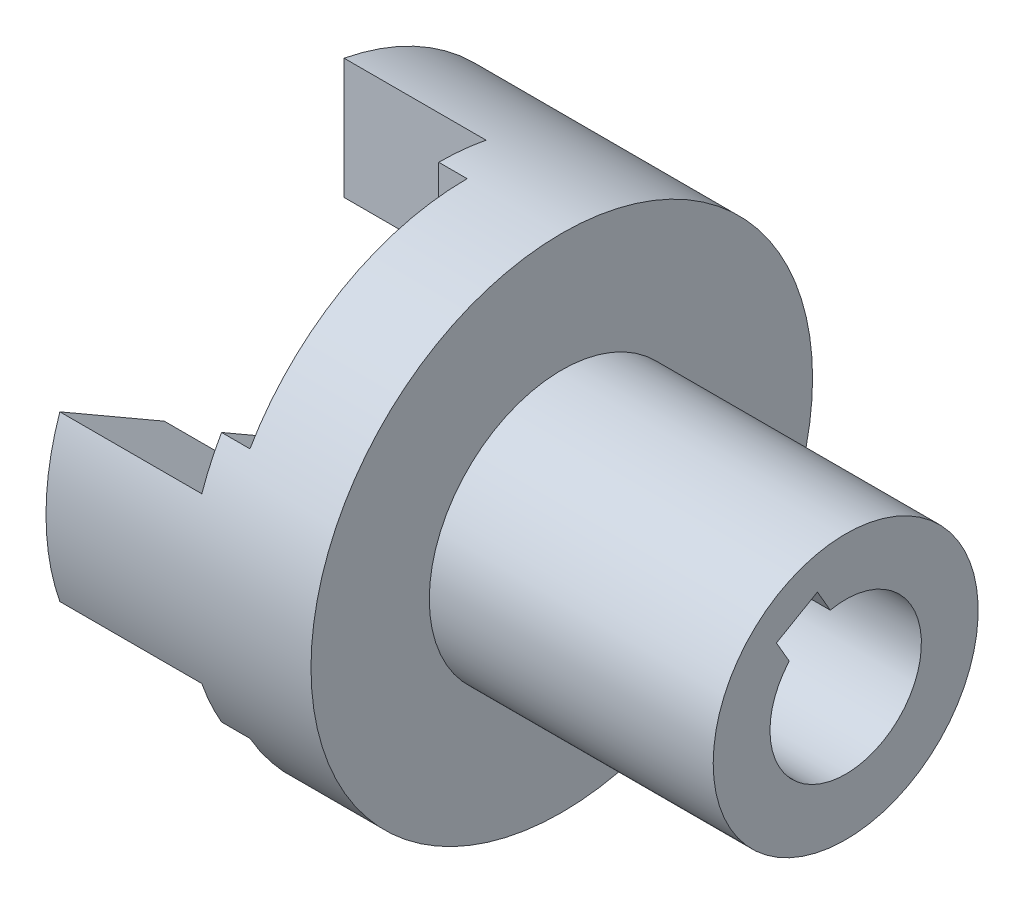
ISO-10303-21;
HEADER;
FILE_DESCRIPTION(('STEP AP214'),'2;1');
FILE_NAME('part.step','',(''),(''),'','','');
FILE_SCHEMA(('AUTOMOTIVE_DESIGN { 1 0 10303 214 1 1 1 1 }'));
ENDSEC;
DATA;
#1=APPLICATION_CONTEXT('core data for automotive mechanical design processes');
#2=APPLICATION_PROTOCOL_DEFINITION('international standard','automotive_design',2000,#1);
#3=PRODUCT_CONTEXT('',#1,'mechanical');
#4=PRODUCT('Part','Part','',(#3));
#5=PRODUCT_RELATED_PRODUCT_CATEGORY('part','',(#4));
#6=PRODUCT_DEFINITION_FORMATION('','',#4);
#7=PRODUCT_DEFINITION_CONTEXT('part definition',#1,'design');
#8=PRODUCT_DEFINITION('design','',#6,#7);
#9=PRODUCT_DEFINITION_SHAPE('','',#8);
#10=(LENGTH_UNIT() NAMED_UNIT(*) SI_UNIT(.MILLI.,.METRE.));
#11=(NAMED_UNIT(*) PLANE_ANGLE_UNIT() SI_UNIT($,.RADIAN.));
#12=(NAMED_UNIT(*) SI_UNIT($,.STERADIAN.) SOLID_ANGLE_UNIT());
#13=UNCERTAINTY_MEASURE_WITH_UNIT(LENGTH_MEASURE(1.E-05),#10,'distance_accuracy_value','');
#14=(GEOMETRIC_REPRESENTATION_CONTEXT(3) GLOBAL_UNCERTAINTY_ASSIGNED_CONTEXT((#13)) GLOBAL_UNIT_ASSIGNED_CONTEXT((#10,
#11,#12)) REPRESENTATION_CONTEXT('',''));
#15=CARTESIAN_POINT('',(0.,0.,0.));
#16=DIRECTION('',(0.,0.,1.));
#17=DIRECTION('',(1.,0.,0.));
#18=AXIS2_PLACEMENT_3D('',#15,#16,#17);
#19=CARTESIAN_POINT('',(-3.,0.,0.));
#20=DIRECTION('',(1.,0.,0.));
#21=DIRECTION('',(0.,0.866025403784443,0.499999999999992));
#22=AXIS2_PLACEMENT_3D('',#19,#20,#21);
#23=PLANE('',#22);
#24=DIRECTION('',(0.,1.,0.));
#25=VECTOR('',#24,1.);
#26=CARTESIAN_POINT('',(-3.,-26.0240273593462,-4.99999999999985));
#27=LINE('',#26,#25);
#28=CARTESIAN_POINT('',(-3.,-26.0240273593462,-4.99999999999985));
#29=VERTEX_POINT('',#28);
#30=CARTESIAN_POINT('',(-3.,-13.2790561913614,-4.99999999999993));
#31=VERTEX_POINT('',#30);
#32=EDGE_CURVE('E55',#29,#31,#27,.T.);
#33=ORIENTED_EDGE('',*,*,#32,.F.);
#34=CARTESIAN_POINT('',(-3.,0.,0.));
#35=DIRECTION('',(-1.,0.,0.));
#36=DIRECTION('',(0.,0.866025403784443,0.499999999999992));
#37=AXIS2_PLACEMENT_3D('',#34,#35,#36);
#38=CIRCLE('',#37,26.5);
#39=CARTESIAN_POINT('',(-3.,-26.5,1.6826817716975E-13));
#40=VERTEX_POINT('',#39);
#41=EDGE_CURVE('E307',#29,#40,#38,.T.);
#42=ORIENTED_EDGE('',*,*,#41,.T.);
#43=DIRECTION('',(0.,1.,0.));
#44=VECTOR('',#43,1.);
#45=CARTESIAN_POINT('',(-3.,-26.5,1.6826817716975E-13));
#46=LINE('',#45,#44);
#47=CARTESIAN_POINT('',(-3.,-16.1658075373095,1.18828558104411E-13));
#48=VERTEX_POINT('',#47);
#49=EDGE_CURVE('E310',#40,#48,#46,.T.);
#50=ORIENTED_EDGE('',*,*,#49,.T.);
#51=DIRECTION('',(0.,0.499999999999993,-0.866025403784443));
#52=VECTOR('',#51,1.);
#53=CARTESIAN_POINT('',(-3.,-16.1658075373095,1.18828558104411E-13));
#54=LINE('',#53,#52);
#55=EDGE_CURVE('E302',#48,#31,#54,.T.);
#56=ORIENTED_EDGE('',*,*,#55,.T.);
#57=EDGE_LOOP('',(#33,#42,#50,#56));
#58=FACE_BOUND('',#57,.T.);
#59=ADVANCED_FACE('F33',(#58),#23,.F.);
#60=DIRECTION('',(0.,-0.500000000000008,-0.866025403784434));
#61=VECTOR('',#60,1.);
#62=CARTESIAN_POINT('',(-3.,-10.969655114603,-8.99999999999986));
#63=LINE('',#62,#61);
#64=CARTESIAN_POINT('',(-3.,-10.969655114603,-8.99999999999986));
#65=VERTEX_POINT('',#64);
#66=CARTESIAN_POINT('',(-3.,-17.3421406985955,-20.0374688019749));
#67=VERTEX_POINT('',#66);
#68=EDGE_CURVE('E253',#65,#67,#63,.T.);
#69=ORIENTED_EDGE('',*,*,#68,.F.);
#70=CARTESIAN_POINT('',(-3.,-8.08290376865491,-13.9999999999999));
#71=VERTEX_POINT('',#70);
#72=EDGE_CURVE('E305',#65,#71,#54,.T.);
#73=ORIENTED_EDGE('',*,*,#72,.T.);
#74=DIRECTION('',(0.,-0.50000000000001,-0.866025403784433));
#75=VECTOR('',#74,1.);
#76=CARTESIAN_POINT('',(-3.,-8.08290376865491,-13.9999999999999));
#77=LINE('',#76,#75);
#78=CARTESIAN_POINT('',(-3.,-13.2500000000003,-22.9496732002875));
#79=VERTEX_POINT('',#78);
#80=EDGE_CURVE('E304',#71,#79,#77,.T.);
#81=ORIENTED_EDGE('',*,*,#80,.T.);
#82=EDGE_CURVE('E308',#79,#67,#38,.T.);
#83=ORIENTED_EDGE('',*,*,#82,.T.);
#84=EDGE_LOOP('',(#69,#73,#81,#83));
#85=FACE_BOUND('',#84,.T.);
#86=ADVANCED_FACE('F456',(#85),#23,.F.);
#87=CARTESIAN_POINT('',(-3.,0.,0.));
#88=DIRECTION('',(1.,0.,0.));
#89=DIRECTION('',(0.,-0.866025403784436,0.500000000000004));
#90=AXIS2_PLACEMENT_3D('',#87,#88,#89);
#91=PLANE('',#90);
#92=DIRECTION('',(0.,-0.499999999999999,0.86602540378444));
#93=VECTOR('',#92,1.);
#94=CARTESIAN_POINT('',(-3.,17.3421406985953,-20.0374688019751));
#95=LINE('',#94,#93);
#96=CARTESIAN_POINT('',(-3.,17.3421406985953,-20.0374688019751));
#97=VERTEX_POINT('',#96);
#98=CARTESIAN_POINT('',(-3.,10.9696551146029,-8.99999999999999));
#99=VERTEX_POINT('',#98);
#100=EDGE_CURVE('E274',#97,#99,#95,.T.);
#101=ORIENTED_EDGE('',*,*,#100,.F.);
#102=CARTESIAN_POINT('',(-3.,0.,0.));
#103=DIRECTION('',(-1.,0.,0.));
#104=DIRECTION('',(0.,-0.866025403784436,0.500000000000004));
#105=AXIS2_PLACEMENT_3D('',#102,#103,#104);
#106=CIRCLE('',#105,26.5);
#107=CARTESIAN_POINT('',(-3.,13.25,-22.9496732002876));
#108=VERTEX_POINT('',#107);
#109=EDGE_CURVE('E338',#97,#108,#106,.T.);
#110=ORIENTED_EDGE('',*,*,#109,.T.);
#111=DIRECTION('',(0.,-0.5,0.866025403784439));
#112=VECTOR('',#111,1.);
#113=CARTESIAN_POINT('',(-3.,13.25,-22.9496732002876));
#114=LINE('',#113,#112);
#115=CARTESIAN_POINT('',(-3.,8.08290376865472,-14.));
#116=VERTEX_POINT('',#115);
#117=EDGE_CURVE('E341',#108,#116,#114,.T.);
#118=ORIENTED_EDGE('',*,*,#117,.T.);
#119=DIRECTION('',(0.,0.500000000000004,0.866025403784437));
#120=VECTOR('',#119,1.);
#121=CARTESIAN_POINT('',(-3.,8.08290376865472,-14.));
#122=LINE('',#121,#120);
#123=EDGE_CURVE('E333',#116,#99,#122,.T.);
#124=ORIENTED_EDGE('',*,*,#123,.T.);
#125=EDGE_LOOP('',(#101,#110,#118,#124));
#126=FACE_BOUND('',#125,.T.);
#127=ADVANCED_FACE('F461',(#126),#91,.F.);
#128=DIRECTION('',(0.,1.,0.));
#129=VECTOR('',#128,1.);
#130=CARTESIAN_POINT('',(-3.,13.2790561913613,-5.0000000000001));
#131=LINE('',#130,#129);
#132=CARTESIAN_POINT('',(-3.,13.2790561913613,-5.0000000000001));
#133=VERTEX_POINT('',#132);
#134=CARTESIAN_POINT('',(-3.,26.0240273593462,-5.00000000000016));
#135=VERTEX_POINT('',#134);
#136=EDGE_CURVE('E279',#133,#135,#131,.T.);
#137=ORIENTED_EDGE('',*,*,#136,.F.);
#138=CARTESIAN_POINT('',(-3.,16.1658075373095,-1.11022302462516E-13));
#139=VERTEX_POINT('',#138);
#140=EDGE_CURVE('E336',#133,#139,#122,.T.);
#141=ORIENTED_EDGE('',*,*,#140,.T.);
#142=DIRECTION('',(0.,1.,0.));
#143=VECTOR('',#142,1.);
#144=CARTESIAN_POINT('',(-3.,16.1658075373095,-1.11022302462516E-13));
#145=LINE('',#144,#143);
#146=CARTESIAN_POINT('',(-3.,26.5,-1.89084858881472E-13));
#147=VERTEX_POINT('',#146);
#148=EDGE_CURVE('E335',#139,#147,#145,.T.);
#149=ORIENTED_EDGE('',*,*,#148,.T.);
#150=EDGE_CURVE('E339',#147,#135,#106,.T.);
#151=ORIENTED_EDGE('',*,*,#150,.T.);
#152=EDGE_LOOP('',(#137,#141,#149,#151));
#153=FACE_BOUND('',#152,.T.);
#154=ADVANCED_FACE('F482',(#153),#91,.F.);
#155=CARTESIAN_POINT('',(0.,8.,0.));
#156=DIRECTION('',(1.,0.,0.));
#157=DIRECTION('',(0.,0.,-1.));
#158=AXIS2_PLACEMENT_3D('',#155,#156,#157);
#159=PLANE('',#158);
#160=DIRECTION('',(0.,-0.499999999999998,0.86602540378444));
#161=VECTOR('',#160,1.);
#162=CARTESIAN_POINT('',(0.,10.9200616589798,1.68589838486226));
#163=LINE('',#162,#161);
#164=CARTESIAN_POINT('',(0.,10.1700616589798,2.98493649053892));
#165=VERTEX_POINT('',#164);
#166=CARTESIAN_POINT('',(0.,7.67006165897976,7.31506350946112));
#167=VERTEX_POINT('',#166);
#168=EDGE_CURVE('E225',#165,#167,#163,.T.);
#169=ORIENTED_EDGE('',*,*,#168,.T.);
#170=DIRECTION('',(0.,-0.866025403784439,-0.5));
#171=VECTOR('',#170,1.);
#172=CARTESIAN_POINT('',(0.,4.75,5.62916512459885));
#173=LINE('',#172,#171);
#174=CARTESIAN_POINT('',(0.,5.33122329054409,5.96473454785376));
#175=VERTEX_POINT('',#174);
#176=EDGE_CURVE('E246',#167,#175,#173,.T.);
#177=ORIENTED_EDGE('',*,*,#176,.T.);
#178=CARTESIAN_POINT('',(0.,0.,0.));
#179=DIRECTION('',(-1.,0.,0.));
#180=DIRECTION('',(0.,0.,1.));
#181=AXIS2_PLACEMENT_3D('',#178,#179,#180);
#182=CIRCLE('',#181,8.);
#183=CARTESIAN_POINT('',(0.,7.83122329054409,1.63460752893157));
#184=VERTEX_POINT('',#183);
#185=EDGE_CURVE('E41',#184,#175,#182,.T.);
#186=ORIENTED_EDGE('',*,*,#185,.F.);
#187=DIRECTION('',(0.,0.866025403784439,0.5));
#188=VECTOR('',#187,1.);
#189=CARTESIAN_POINT('',(0.,7.25,1.29903810567666));
#190=LINE('',#189,#188);
#191=EDGE_CURVE('E240',#184,#165,#190,.T.);
#192=ORIENTED_EDGE('',*,*,#191,.T.);
#193=EDGE_LOOP('',(#169,#177,#186,#192));
#194=FACE_BOUND('',#193,.T.);
#195=DIRECTION('',(0.,-0.50000000000001,-0.866025403784433));
#196=VECTOR('',#195,1.);
#197=CARTESIAN_POINT('',(0.,-8.08290376865491,-13.9999999999999));
#198=LINE('',#197,#196);
#199=CARTESIAN_POINT('',(0.,-8.08290376865491,-13.9999999999999));
#200=VERTEX_POINT('',#199);
#201=CARTESIAN_POINT('',(0.,-13.2500000000003,-22.9496732002875));
#202=VERTEX_POINT('',#201);
#203=EDGE_CURVE('E315',#200,#202,#198,.T.);
#204=ORIENTED_EDGE('',*,*,#203,.F.);
#205=DIRECTION('',(0.,0.499999999999993,-0.866025403784443));
#206=VECTOR('',#205,1.);
#207=CARTESIAN_POINT('',(0.,-16.1658075373095,1.18828558104411E-13));
#208=LINE('',#207,#206);
#209=CARTESIAN_POINT('',(0.,-16.1658075373095,1.1663851431131E-13));
#210=VERTEX_POINT('',#209);
#211=EDGE_CURVE('E301',#210,#200,#208,.T.);
#212=ORIENTED_EDGE('',*,*,#211,.F.);
#213=DIRECTION('',(0.,1.,0.));
#214=VECTOR('',#213,1.);
#215=CARTESIAN_POINT('',(0.,-26.5,1.6826817716975E-13));
#216=LINE('',#215,#214);
#217=CARTESIAN_POINT('',(0.,-26.5,1.6826817716975E-13));
#218=VERTEX_POINT('',#217);
#219=EDGE_CURVE('E318',#218,#210,#216,.T.);
#220=ORIENTED_EDGE('',*,*,#219,.F.);
#221=CARTESIAN_POINT('',(0.,0.,0.));
#222=DIRECTION('',(-1.,0.,0.));
#223=DIRECTION('',(0.,0.,1.));
#224=AXIS2_PLACEMENT_3D('',#221,#222,#223);
#225=CIRCLE('',#224,26.5);
#226=CARTESIAN_POINT('',(0.,-13.2499999999999,22.9496732002877));
#227=VERTEX_POINT('',#226);
#228=EDGE_CURVE('E432',#218,#227,#225,.T.);
#229=ORIENTED_EDGE('',*,*,#228,.T.);
#230=DIRECTION('',(0.,-0.499999999999998,0.86602540378444));
#231=VECTOR('',#230,1.);
#232=CARTESIAN_POINT('',(0.,-8.08290376865471,14.));
#233=LINE('',#232,#231);
#234=CARTESIAN_POINT('',(0.,-8.08290376865471,14.));
#235=VERTEX_POINT('',#234);
#236=EDGE_CURVE('E404',#235,#227,#233,.T.);
#237=ORIENTED_EDGE('',*,*,#236,.F.);
#238=DIRECTION('',(0.,-1.,0.));
#239=VECTOR('',#238,1.);
#240=CARTESIAN_POINT('',(0.,8.08290376865473,14.));
#241=LINE('',#240,#239);
#242=CARTESIAN_POINT('',(0.,8.08290376865473,14.));
#243=VERTEX_POINT('',#242);
#244=EDGE_CURVE('E390',#243,#235,#241,.T.);
#245=ORIENTED_EDGE('',*,*,#244,.F.);
#246=DIRECTION('',(0.,-0.499999999999996,-0.866025403784441));
#247=VECTOR('',#246,1.);
#248=CARTESIAN_POINT('',(0.,13.2499999999999,22.9496732002877));
#249=LINE('',#248,#247);
#250=CARTESIAN_POINT('',(0.,13.2499999999999,22.9496732002877));
#251=VERTEX_POINT('',#250);
#252=EDGE_CURVE('E407',#251,#243,#249,.T.);
#253=ORIENTED_EDGE('',*,*,#252,.F.);
#254=CARTESIAN_POINT('',(0.,26.5,-1.89084858881472E-13));
#255=VERTEX_POINT('',#254);
#256=EDGE_CURVE('E433',#251,#255,#225,.T.);
#257=ORIENTED_EDGE('',*,*,#256,.T.);
#258=DIRECTION('',(0.,1.,0.));
#259=VECTOR('',#258,1.);
#260=CARTESIAN_POINT('',(0.,16.1658075373095,-1.11022302462516E-13));
#261=LINE('',#260,#259);
#262=CARTESIAN_POINT('',(0.,16.1658075373095,-1.11022302462516E-13));
#263=VERTEX_POINT('',#262);
#264=EDGE_CURVE('E346',#263,#255,#261,.T.);
#265=ORIENTED_EDGE('',*,*,#264,.F.);
#266=DIRECTION('',(0.,0.500000000000004,0.866025403784437));
#267=VECTOR('',#266,1.);
#268=CARTESIAN_POINT('',(0.,8.08290376865472,-14.));
#269=LINE('',#268,#267);
#270=CARTESIAN_POINT('',(0.,8.08290376865471,-14.));
#271=VERTEX_POINT('',#270);
#272=EDGE_CURVE('E332',#271,#263,#269,.T.);
#273=ORIENTED_EDGE('',*,*,#272,.F.);
#274=DIRECTION('',(0.,-0.5,0.866025403784439));
#275=VECTOR('',#274,1.);
#276=CARTESIAN_POINT('',(0.,13.25,-22.9496732002876));
#277=LINE('',#276,#275);
#278=CARTESIAN_POINT('',(0.,13.25,-22.9496732002876));
#279=VERTEX_POINT('',#278);
#280=EDGE_CURVE('E349',#279,#271,#277,.T.);
#281=ORIENTED_EDGE('',*,*,#280,.F.);
#282=EDGE_CURVE('E434',#279,#202,#225,.T.);
#283=ORIENTED_EDGE('',*,*,#282,.T.);
#284=EDGE_LOOP('',(#204,#212,#220,#229,#237,#245,#253,#257,#265,#273,#281,#283));
#285=FACE_BOUND('',#284,.T.);
#286=ADVANCED_FACE('F439',(#194,#285),#159,.F.);
#287=CARTESIAN_POINT('',(-3.,0.,0.));
#288=DIRECTION('',(1.,0.,0.));
#289=DIRECTION('',(0.,0.,-1.));
#290=AXIS2_PLACEMENT_3D('',#287,#288,#289);
#291=PLANE('',#290);
#292=DIRECTION('',(0.,-0.5,0.866025403784439));
#293=VECTOR('',#292,1.);
#294=CARTESIAN_POINT('',(-3.,-2.30940107675846,14.));
#295=LINE('',#294,#293);
#296=CARTESIAN_POINT('',(-3.,-2.30940107675845,14.));
#297=VERTEX_POINT('',#296);
#298=CARTESIAN_POINT('',(-3.,-8.68188666075087,25.0374688019751));
#299=VERTEX_POINT('',#298);
#300=EDGE_CURVE('E368',#297,#299,#295,.T.);
#301=ORIENTED_EDGE('',*,*,#300,.F.);
#302=DIRECTION('',(0.,-1.,0.));
#303=VECTOR('',#302,1.);
#304=CARTESIAN_POINT('',(-3.,8.08290376865473,14.));
#305=LINE('',#304,#303);
#306=CARTESIAN_POINT('',(-3.,-8.08290376865471,14.));
#307=VERTEX_POINT('',#306);
#308=EDGE_CURVE('E394',#297,#307,#305,.T.);
#309=ORIENTED_EDGE('',*,*,#308,.T.);
#310=DIRECTION('',(0.,-0.499999999999998,0.86602540378444));
#311=VECTOR('',#310,1.);
#312=CARTESIAN_POINT('',(-3.,-8.08290376865471,14.));
#313=LINE('',#312,#311);
#314=CARTESIAN_POINT('',(-3.,-13.2499999999999,22.9496732002877));
#315=VERTEX_POINT('',#314);
#316=EDGE_CURVE('E393',#307,#315,#313,.T.);
#317=ORIENTED_EDGE('',*,*,#316,.T.);
#318=CARTESIAN_POINT('',(-3.,0.,0.));
#319=DIRECTION('',(-1.,0.,0.));
#320=DIRECTION('',(0.,0.,-1.));
#321=AXIS2_PLACEMENT_3D('',#318,#319,#320);
#322=CIRCLE('',#321,26.5);
#323=EDGE_CURVE('E397',#315,#299,#322,.T.);
#324=ORIENTED_EDGE('',*,*,#323,.T.);
#325=EDGE_LOOP('',(#301,#309,#317,#324));
#326=FACE_BOUND('',#325,.T.);
#327=ADVANCED_FACE('F508',(#326),#291,.F.);
#328=DIRECTION('',(0.,-0.499999999999997,-0.86602540378444));
#329=VECTOR('',#328,1.);
#330=CARTESIAN_POINT('',(-3.,8.68188666075082,25.0374688019751));
#331=LINE('',#330,#329);
#332=CARTESIAN_POINT('',(-3.,8.68188666075082,25.0374688019751));
#333=VERTEX_POINT('',#332);
#334=CARTESIAN_POINT('',(-3.,2.30940107675844,14.));
#335=VERTEX_POINT('',#334);
#336=EDGE_CURVE('E363',#333,#335,#331,.T.);
#337=ORIENTED_EDGE('',*,*,#336,.F.);
#338=CARTESIAN_POINT('',(-3.,13.2499999999999,22.9496732002877));
#339=VERTEX_POINT('',#338);
#340=EDGE_CURVE('E396',#333,#339,#322,.T.);
#341=ORIENTED_EDGE('',*,*,#340,.T.);
#342=DIRECTION('',(0.,-0.499999999999996,-0.866025403784441));
#343=VECTOR('',#342,1.);
#344=CARTESIAN_POINT('',(-3.,13.2499999999999,22.9496732002877));
#345=LINE('',#344,#343);
#346=CARTESIAN_POINT('',(-3.,8.08290376865473,14.));
#347=VERTEX_POINT('',#346);
#348=EDGE_CURVE('E399',#339,#347,#345,.T.);
#349=ORIENTED_EDGE('',*,*,#348,.T.);
#350=EDGE_CURVE('E391',#347,#335,#305,.T.);
#351=ORIENTED_EDGE('',*,*,#350,.T.);
#352=EDGE_LOOP('',(#337,#341,#349,#351));
#353=FACE_BOUND('',#352,.T.);
#354=ADVANCED_FACE('F511',(#353),#291,.F.);
#355=CARTESIAN_POINT('',(0.,0.,0.));
#356=DIRECTION('',(-1.,0.,0.));
#357=DIRECTION('',(0.,0.,1.));
#358=AXIS2_PLACEMENT_3D('',#355,#356,#357);
#359=CYLINDRICAL_SURFACE('',#358,8.);
#360=ORIENTED_EDGE('',*,*,#185,.T.);
#361=DIRECTION('',(-1.,0.,0.));
#362=VECTOR('',#361,1.);
#363=CARTESIAN_POINT('',(0.,5.33122329054409,5.96473454785376));
#364=LINE('',#363,#362);
#365=CARTESIAN_POINT('',(40.,5.33122329054409,5.96473454785376));
#366=VERTEX_POINT('',#365);
#367=EDGE_CURVE('E243',#175,#366,#364,.F.);
#368=ORIENTED_EDGE('',*,*,#367,.T.);
#369=CARTESIAN_POINT('',(40.,0.,0.));
#370=DIRECTION('',(-1.,0.,0.));
#371=DIRECTION('',(0.,0.,1.));
#372=AXIS2_PLACEMENT_3D('',#369,#370,#371);
#373=CIRCLE('',#372,8.);
#374=CARTESIAN_POINT('',(40.,7.83122329054409,1.63460752893157));
#375=VERTEX_POINT('',#374);
#376=EDGE_CURVE('E421',#375,#366,#373,.T.);
#377=ORIENTED_EDGE('',*,*,#376,.F.);
#378=DIRECTION('',(-1.,0.,0.));
#379=VECTOR('',#378,1.);
#380=CARTESIAN_POINT('',(0.,7.83122329054409,1.63460752893157));
#381=LINE('',#380,#379);
#382=EDGE_CURVE('E48',#375,#184,#381,.T.);
#383=ORIENTED_EDGE('',*,*,#382,.T.);
#384=EDGE_LOOP('',(#360,#368,#377,#383));
#385=FACE_BOUND('',#384,.T.);
#386=ADVANCED_FACE('F35',(#385),#359,.F.);
#387=CARTESIAN_POINT('',(0.,0.,0.));
#388=DIRECTION('',(-1.,0.,0.));
#389=DIRECTION('',(0.,0.,1.));
#390=AXIS2_PLACEMENT_3D('',#387,#388,#389);
#391=CYLINDRICAL_SURFACE('',#390,26.5);
#392=ORIENTED_EDGE('',*,*,#256,.F.);
#393=DIRECTION('',(1.,0.,0.));
#394=VECTOR('',#393,1.);
#395=CARTESIAN_POINT('',(-3.,13.2499999999999,22.9496732002877));
#396=LINE('',#395,#394);
#397=EDGE_CURVE('E412',#339,#251,#396,.T.);
#398=ORIENTED_EDGE('',*,*,#397,.F.);
#399=ORIENTED_EDGE('',*,*,#340,.F.);
#400=DIRECTION('',(1.,0.,0.));
#401=VECTOR('',#400,1.);
#402=CARTESIAN_POINT('',(-18.,8.68188666075082,25.0374688019751));
#403=LINE('',#402,#401);
#404=CARTESIAN_POINT('',(-18.,8.68188666075082,25.0374688019751));
#405=VERTEX_POINT('',#404);
#406=EDGE_CURVE('E387',#405,#333,#403,.T.);
#407=ORIENTED_EDGE('',*,*,#406,.F.);
#408=CARTESIAN_POINT('',(-18.,0.,0.));
#409=DIRECTION('',(-1.,0.,0.));
#410=DIRECTION('',(0.,0.,-1.));
#411=AXIS2_PLACEMENT_3D('',#408,#409,#410);
#412=CIRCLE('',#411,26.5);
#413=CARTESIAN_POINT('',(-18.,-8.68188666075087,25.0374688019751));
#414=VERTEX_POINT('',#413);
#415=EDGE_CURVE('E364',#414,#405,#412,.T.);
#416=ORIENTED_EDGE('',*,*,#415,.F.);
#417=DIRECTION('',(1.,0.,0.));
#418=VECTOR('',#417,1.);
#419=CARTESIAN_POINT('',(-18.,-8.68188666075087,25.0374688019751));
#420=LINE('',#419,#418);
#421=EDGE_CURVE('E374',#414,#299,#420,.T.);
#422=ORIENTED_EDGE('',*,*,#421,.T.);
#423=ORIENTED_EDGE('',*,*,#323,.F.);
#424=DIRECTION('',(1.,0.,0.));
#425=VECTOR('',#424,1.);
#426=CARTESIAN_POINT('',(-3.,-13.2499999999999,22.9496732002877));
#427=LINE('',#426,#425);
#428=EDGE_CURVE('E415',#315,#227,#427,.T.);
#429=ORIENTED_EDGE('',*,*,#428,.T.);
#430=ORIENTED_EDGE('',*,*,#228,.F.);
#431=DIRECTION('',(1.,0.,0.));
#432=VECTOR('',#431,1.);
#433=CARTESIAN_POINT('',(-3.,-26.5,1.6826817716975E-13));
#434=LINE('',#433,#432);
#435=EDGE_CURVE('E323',#40,#218,#434,.T.);
#436=ORIENTED_EDGE('',*,*,#435,.F.);
#437=ORIENTED_EDGE('',*,*,#41,.F.);
#438=DIRECTION('',(1.,0.,0.));
#439=VECTOR('',#438,1.);
#440=CARTESIAN_POINT('',(-18.,-26.0240273593462,-4.99999999999985));
#441=LINE('',#440,#439);
#442=CARTESIAN_POINT('',(-18.,-26.0240273593462,-4.99999999999985));
#443=VERTEX_POINT('',#442);
#444=EDGE_CURVE('E271',#443,#29,#441,.T.);
#445=ORIENTED_EDGE('',*,*,#444,.F.);
#446=CARTESIAN_POINT('',(-18.,0.,0.));
#447=DIRECTION('',(-1.,0.,0.));
#448=DIRECTION('',(0.,0.866025403784443,0.499999999999992));
#449=AXIS2_PLACEMENT_3D('',#446,#447,#448);
#450=CIRCLE('',#449,26.5);
#451=CARTESIAN_POINT('',(-18.,-17.3421406985955,-20.0374688019749));
#452=VERTEX_POINT('',#451);
#453=EDGE_CURVE('E249',#452,#443,#450,.T.);
#454=ORIENTED_EDGE('',*,*,#453,.F.);
#455=DIRECTION('',(1.,0.,0.));
#456=VECTOR('',#455,1.);
#457=CARTESIAN_POINT('',(-18.,-17.3421406985955,-20.0374688019749));
#458=LINE('',#457,#456);
#459=EDGE_CURVE('E259',#452,#67,#458,.T.);
#460=ORIENTED_EDGE('',*,*,#459,.T.);
#461=ORIENTED_EDGE('',*,*,#82,.F.);
#462=DIRECTION('',(1.,0.,0.));
#463=VECTOR('',#462,1.);
#464=CARTESIAN_POINT('',(-3.,-13.2500000000003,-22.9496732002875));
#465=LINE('',#464,#463);
#466=EDGE_CURVE('E326',#79,#202,#465,.T.);
#467=ORIENTED_EDGE('',*,*,#466,.T.);
#468=ORIENTED_EDGE('',*,*,#282,.F.);
#469=DIRECTION('',(1.,0.,0.));
#470=VECTOR('',#469,1.);
#471=CARTESIAN_POINT('',(-3.,13.25,-22.9496732002876));
#472=LINE('',#471,#470);
#473=EDGE_CURVE('E354',#108,#279,#472,.T.);
#474=ORIENTED_EDGE('',*,*,#473,.F.);
#475=ORIENTED_EDGE('',*,*,#109,.F.);
#476=DIRECTION('',(1.,0.,0.));
#477=VECTOR('',#476,1.);
#478=CARTESIAN_POINT('',(-18.,17.3421406985953,-20.0374688019751));
#479=LINE('',#478,#477);
#480=CARTESIAN_POINT('',(-18.,17.3421406985953,-20.0374688019751));
#481=VERTEX_POINT('',#480);
#482=EDGE_CURVE('E298',#481,#97,#479,.T.);
#483=ORIENTED_EDGE('',*,*,#482,.F.);
#484=CARTESIAN_POINT('',(-18.,0.,0.));
#485=DIRECTION('',(-1.,0.,0.));
#486=DIRECTION('',(0.,-0.866025403784436,0.500000000000004));
#487=AXIS2_PLACEMENT_3D('',#484,#485,#486);
#488=CIRCLE('',#487,26.5);
#489=CARTESIAN_POINT('',(-18.,26.0240273593462,-5.00000000000016));
#490=VERTEX_POINT('',#489);
#491=EDGE_CURVE('E275',#490,#481,#488,.T.);
#492=ORIENTED_EDGE('',*,*,#491,.F.);
#493=DIRECTION('',(1.,0.,0.));
#494=VECTOR('',#493,1.);
#495=CARTESIAN_POINT('',(-18.,26.0240273593462,-5.00000000000016));
#496=LINE('',#495,#494);
#497=EDGE_CURVE('E285',#490,#135,#496,.T.);
#498=ORIENTED_EDGE('',*,*,#497,.T.);
#499=ORIENTED_EDGE('',*,*,#150,.F.);
#500=DIRECTION('',(1.,0.,0.));
#501=VECTOR('',#500,1.);
#502=CARTESIAN_POINT('',(-3.,26.5,-1.89084858881472E-13));
#503=LINE('',#502,#501);
#504=EDGE_CURVE('E357',#147,#255,#503,.T.);
#505=ORIENTED_EDGE('',*,*,#504,.T.);
#506=EDGE_LOOP('',(#392,#398,#399,#407,#416,#422,#423,#429,#430,#436,#437,#445,#454,#460,#461,
#467,#468,#474,#475,#483,#492,#498,#499,#505));
#507=FACE_BOUND('',#506,.T.);
#508=CARTESIAN_POINT('',(10.,0.,0.));
#509=DIRECTION('',(-1.,0.,0.));
#510=DIRECTION('',(0.,0.,1.));
#511=AXIS2_PLACEMENT_3D('',#508,#509,#510);
#512=CIRCLE('',#511,26.5);
#513=CARTESIAN_POINT('',(10.,0.,26.5));
#514=VERTEX_POINT('',#513);
#515=EDGE_CURVE('E429',#514,#514,#512,.T.);
#516=ORIENTED_EDGE('',*,*,#515,.T.);
#517=EDGE_LOOP('',(#516));
#518=FACE_BOUND('',#517,.T.);
#519=ADVANCED_FACE('F534',(#507,#518),#391,.T.);
#520=CARTESIAN_POINT('',(10.,26.5,0.));
#521=DIRECTION('',(-1.,0.,0.));
#522=DIRECTION('',(0.,0.,1.));
#523=AXIS2_PLACEMENT_3D('',#520,#521,#522);
#524=PLANE('',#523);
#525=ORIENTED_EDGE('',*,*,#515,.F.);
#526=EDGE_LOOP('',(#525));
#527=FACE_BOUND('',#526,.T.);
#528=CARTESIAN_POINT('',(10.,0.,0.));
#529=DIRECTION('',(-1.,0.,0.));
#530=DIRECTION('',(0.,0.,1.));
#531=AXIS2_PLACEMENT_3D('',#528,#529,#530);
#532=CIRCLE('',#531,14.);
#533=CARTESIAN_POINT('',(10.,0.,14.));
#534=VERTEX_POINT('',#533);
#535=EDGE_CURVE('E426',#534,#534,#532,.T.);
#536=ORIENTED_EDGE('',*,*,#535,.T.);
#537=EDGE_LOOP('',(#536));
#538=FACE_BOUND('',#537,.T.);
#539=ADVANCED_FACE('F530',(#527,#538),#524,.F.);
#540=CARTESIAN_POINT('',(0.,0.,0.));
#541=DIRECTION('',(-1.,0.,0.));
#542=DIRECTION('',(0.,0.,1.));
#543=AXIS2_PLACEMENT_3D('',#540,#541,#542);
#544=CYLINDRICAL_SURFACE('',#543,14.);
#545=ORIENTED_EDGE('',*,*,#535,.F.);
#546=EDGE_LOOP('',(#545));
#547=FACE_BOUND('',#546,.T.);
#548=CARTESIAN_POINT('',(40.,0.,0.));
#549=DIRECTION('',(-1.,0.,0.));
#550=DIRECTION('',(0.,0.,1.));
#551=AXIS2_PLACEMENT_3D('',#548,#549,#550);
#552=CIRCLE('',#551,14.);
#553=CARTESIAN_POINT('',(40.,0.,14.));
#554=VERTEX_POINT('',#553);
#555=EDGE_CURVE('E423',#554,#554,#552,.T.);
#556=ORIENTED_EDGE('',*,*,#555,.T.);
#557=EDGE_LOOP('',(#556));
#558=FACE_BOUND('',#557,.T.);
#559=ADVANCED_FACE('F526',(#547,#558),#544,.T.);
#560=CARTESIAN_POINT('',(40.,14.,0.));
#561=DIRECTION('',(-1.,0.,0.));
#562=DIRECTION('',(0.,0.,1.));
#563=AXIS2_PLACEMENT_3D('',#560,#561,#562);
#564=PLANE('',#563);
#565=ORIENTED_EDGE('',*,*,#555,.F.);
#566=EDGE_LOOP('',(#565));
#567=FACE_BOUND('',#566,.T.);
#568=ORIENTED_EDGE('',*,*,#376,.T.);
#569=DIRECTION('',(0.,-0.866025403784439,-0.5));
#570=VECTOR('',#569,1.);
#571=CARTESIAN_POINT('',(40.,-1.24999999999995,2.16506350946112));
#572=LINE('',#571,#570);
#573=CARTESIAN_POINT('',(40.,7.67006165897976,7.31506350946112));
#574=VERTEX_POINT('',#573);
#575=EDGE_CURVE('E234',#574,#366,#572,.T.);
#576=ORIENTED_EDGE('',*,*,#575,.F.);
#577=DIRECTION('',(0.,-0.499999999999998,0.86602540378444));
#578=VECTOR('',#577,1.);
#579=CARTESIAN_POINT('',(40.,7.67006165897976,7.31506350946112));
#580=LINE('',#579,#578);
#581=CARTESIAN_POINT('',(40.,10.1700616589798,2.98493649053892));
#582=VERTEX_POINT('',#581);
#583=EDGE_CURVE('E222',#582,#574,#580,.T.);
#584=ORIENTED_EDGE('',*,*,#583,.F.);
#585=DIRECTION('',(0.,-0.866025403784439,-0.5));
#586=VECTOR('',#585,1.);
#587=CARTESIAN_POINT('',(40.,11.75,3.89711431702997));
#588=LINE('',#587,#586);
#589=EDGE_CURVE('E11',#582,#375,#588,.T.);
#590=ORIENTED_EDGE('',*,*,#589,.T.);
#591=EDGE_LOOP('',(#568,#576,#584,#590));
#592=FACE_BOUND('',#591,.T.);
#593=ADVANCED_FACE('F233',(#567,#592),#564,.F.);
#594=CARTESIAN_POINT('',(-3.,8.08290376865473,14.));
#595=DIRECTION('',(0.,0.,1.));
#596=DIRECTION('',(0.,-1.,0.));
#597=AXIS2_PLACEMENT_3D('',#594,#595,#596);
#598=PLANE('',#597);
#599=ORIENTED_EDGE('',*,*,#244,.T.);
#600=DIRECTION('',(1.,0.,0.));
#601=VECTOR('',#600,1.);
#602=CARTESIAN_POINT('',(-3.,-8.08290376865471,14.));
#603=LINE('',#602,#601);
#604=EDGE_CURVE('E418',#307,#235,#603,.T.);
#605=ORIENTED_EDGE('',*,*,#604,.F.);
#606=ORIENTED_EDGE('',*,*,#308,.F.);
#607=DIRECTION('',(1.,0.,0.));
#608=VECTOR('',#607,1.);
#609=CARTESIAN_POINT('',(-18.,-2.30940107675846,14.));
#610=LINE('',#609,#608);
#611=CARTESIAN_POINT('',(-18.,-2.30940107675846,14.));
#612=VERTEX_POINT('',#611);
#613=EDGE_CURVE('E381',#612,#297,#610,.T.);
#614=ORIENTED_EDGE('',*,*,#613,.F.);
#615=DIRECTION('',(0.,-1.,0.));
#616=VECTOR('',#615,1.);
#617=CARTESIAN_POINT('',(-18.,2.30940107675844,14.));
#618=LINE('',#617,#616);
#619=CARTESIAN_POINT('',(-18.,2.30940107675844,14.));
#620=VERTEX_POINT('',#619);
#621=EDGE_CURVE('E370',#620,#612,#618,.T.);
#622=ORIENTED_EDGE('',*,*,#621,.F.);
#623=DIRECTION('',(1.,0.,0.));
#624=VECTOR('',#623,1.);
#625=CARTESIAN_POINT('',(-18.,2.30940107675844,14.));
#626=LINE('',#625,#624);
#627=EDGE_CURVE('E384',#620,#335,#626,.T.);
#628=ORIENTED_EDGE('',*,*,#627,.T.);
#629=ORIENTED_EDGE('',*,*,#350,.F.);
#630=DIRECTION('',(1.,0.,0.));
#631=VECTOR('',#630,1.);
#632=CARTESIAN_POINT('',(-3.,8.08290376865473,14.));
#633=LINE('',#632,#631);
#634=EDGE_CURVE('E401',#347,#243,#633,.T.);
#635=ORIENTED_EDGE('',*,*,#634,.T.);
#636=EDGE_LOOP('',(#599,#605,#606,#614,#622,#628,#629,#635));
#637=FACE_BOUND('',#636,.T.);
#638=ADVANCED_FACE('F519',(#637),#598,.F.);
#639=CARTESIAN_POINT('',(-3.,-8.08290376865471,14.));
#640=DIRECTION('',(0.,0.86602540378444,0.499999999999998));
#641=DIRECTION('',(0.,-0.499999999999998,0.86602540378444));
#642=AXIS2_PLACEMENT_3D('',#639,#640,#641);
#643=PLANE('',#642);
#644=ORIENTED_EDGE('',*,*,#236,.T.);
#645=ORIENTED_EDGE('',*,*,#428,.F.);
#646=ORIENTED_EDGE('',*,*,#316,.F.);
#647=ORIENTED_EDGE('',*,*,#604,.T.);
#648=EDGE_LOOP('',(#644,#645,#646,#647));
#649=FACE_BOUND('',#648,.T.);
#650=ADVANCED_FACE('F515',(#649),#643,.F.);
#651=CARTESIAN_POINT('',(-3.,13.2499999999999,22.9496732002877));
#652=DIRECTION('',(0.,-0.866025403784441,0.499999999999996));
#653=DIRECTION('',(0.,-0.499999999999996,-0.866025403784441));
#654=AXIS2_PLACEMENT_3D('',#651,#652,#653);
#655=PLANE('',#654);
#656=ORIENTED_EDGE('',*,*,#252,.T.);
#657=ORIENTED_EDGE('',*,*,#634,.F.);
#658=ORIENTED_EDGE('',*,*,#348,.F.);
#659=ORIENTED_EDGE('',*,*,#397,.T.);
#660=EDGE_LOOP('',(#656,#657,#658,#659));
#661=FACE_BOUND('',#660,.T.);
#662=ADVANCED_FACE('F506',(#661),#655,.F.);
#663=CARTESIAN_POINT('',(-18.,8.68188666075082,25.0374688019751));
#664=DIRECTION('',(0.,-0.86602540378444,0.499999999999997));
#665=DIRECTION('',(0.,-0.499999999999997,-0.86602540378444));
#666=AXIS2_PLACEMENT_3D('',#663,#664,#665);
#667=PLANE('',#666);
#668=ORIENTED_EDGE('',*,*,#336,.T.);
#669=ORIENTED_EDGE('',*,*,#627,.F.);
#670=DIRECTION('',(0.,-0.499999999999997,-0.86602540378444));
#671=VECTOR('',#670,1.);
#672=CARTESIAN_POINT('',(-18.,8.68188666075082,25.0374688019751));
#673=LINE('',#672,#671);
#674=EDGE_CURVE('E367',#405,#620,#673,.T.);
#675=ORIENTED_EDGE('',*,*,#674,.F.);
#676=ORIENTED_EDGE('',*,*,#406,.T.);
#677=EDGE_LOOP('',(#668,#669,#675,#676));
#678=FACE_BOUND('',#677,.T.);
#679=ADVANCED_FACE('F502',(#678),#667,.F.);
#680=CARTESIAN_POINT('',(-18.,-2.30940107675846,14.));
#681=DIRECTION('',(0.,0.866025403784439,0.5));
#682=DIRECTION('',(0.,-0.5,0.866025403784439));
#683=AXIS2_PLACEMENT_3D('',#680,#681,#682);
#684=PLANE('',#683);
#685=ORIENTED_EDGE('',*,*,#300,.T.);
#686=ORIENTED_EDGE('',*,*,#421,.F.);
#687=DIRECTION('',(0.,-0.5,0.866025403784439));
#688=VECTOR('',#687,1.);
#689=CARTESIAN_POINT('',(-18.,-2.30940107675846,14.));
#690=LINE('',#689,#688);
#691=EDGE_CURVE('E372',#612,#414,#690,.T.);
#692=ORIENTED_EDGE('',*,*,#691,.F.);
#693=ORIENTED_EDGE('',*,*,#613,.T.);
#694=EDGE_LOOP('',(#685,#686,#692,#693));
#695=FACE_BOUND('',#694,.T.);
#696=ADVANCED_FACE('F498',(#695),#684,.F.);
#697=CARTESIAN_POINT('',(-18.,0.,0.));
#698=DIRECTION('',(1.,0.,0.));
#699=DIRECTION('',(0.,0.,-1.));
#700=AXIS2_PLACEMENT_3D('',#697,#698,#699);
#701=PLANE('',#700);
#702=ORIENTED_EDGE('',*,*,#415,.T.);
#703=ORIENTED_EDGE('',*,*,#674,.T.);
#704=ORIENTED_EDGE('',*,*,#621,.T.);
#705=ORIENTED_EDGE('',*,*,#691,.T.);
#706=EDGE_LOOP('',(#702,#703,#704,#705));
#707=FACE_BOUND('',#706,.T.);
#708=ADVANCED_FACE('F494',(#707),#701,.F.);
#709=CARTESIAN_POINT('',(-3.,8.08290376865472,-14.));
#710=DIRECTION('',(0.,0.866025403784437,-0.500000000000003));
#711=DIRECTION('',(0.,0.500000000000003,0.866025403784437));
#712=AXIS2_PLACEMENT_3D('',#709,#710,#711);
#713=PLANE('',#712);
#714=ORIENTED_EDGE('',*,*,#272,.T.);
#715=DIRECTION('',(1.,0.,0.));
#716=VECTOR('',#715,1.);
#717=CARTESIAN_POINT('',(-3.,16.1658075373095,-1.11022302462516E-13));
#718=LINE('',#717,#716);
#719=EDGE_CURVE('E360',#139,#263,#718,.T.);
#720=ORIENTED_EDGE('',*,*,#719,.F.);
#721=ORIENTED_EDGE('',*,*,#140,.F.);
#722=DIRECTION('',(1.,0.,0.));
#723=VECTOR('',#722,1.);
#724=CARTESIAN_POINT('',(-18.,13.2790561913613,-5.0000000000001));
#725=LINE('',#724,#723);
#726=CARTESIAN_POINT('',(-18.,13.2790561913613,-5.0000000000001));
#727=VERTEX_POINT('',#726);
#728=EDGE_CURVE('E292',#727,#133,#725,.T.);
#729=ORIENTED_EDGE('',*,*,#728,.F.);
#730=DIRECTION('',(0.,0.500000000000003,0.866025403784437));
#731=VECTOR('',#730,1.);
#732=CARTESIAN_POINT('',(-18.,10.9696551146029,-9.));
#733=LINE('',#732,#731);
#734=CARTESIAN_POINT('',(-18.,10.9696551146029,-9.));
#735=VERTEX_POINT('',#734);
#736=EDGE_CURVE('E281',#735,#727,#733,.T.);
#737=ORIENTED_EDGE('',*,*,#736,.F.);
#738=DIRECTION('',(1.,0.,0.));
#739=VECTOR('',#738,1.);
#740=CARTESIAN_POINT('',(-18.,10.9696551146029,-9.));
#741=LINE('',#740,#739);
#742=EDGE_CURVE('E295',#735,#99,#741,.T.);
#743=ORIENTED_EDGE('',*,*,#742,.T.);
#744=ORIENTED_EDGE('',*,*,#123,.F.);
#745=DIRECTION('',(1.,0.,0.));
#746=VECTOR('',#745,1.);
#747=CARTESIAN_POINT('',(-3.,8.08290376865472,-14.));
#748=LINE('',#747,#746);
#749=EDGE_CURVE('E343',#116,#271,#748,.T.);
#750=ORIENTED_EDGE('',*,*,#749,.T.);
#751=EDGE_LOOP('',(#714,#720,#721,#729,#737,#743,#744,#750));
#752=FACE_BOUND('',#751,.T.);
#753=ADVANCED_FACE('F490',(#752),#713,.F.);
#754=CARTESIAN_POINT('',(-3.,16.1658075373095,-1.11022302462516E-13));
#755=DIRECTION('',(0.,0.,-1.));
#756=DIRECTION('',(0.,1.,0.));
#757=AXIS2_PLACEMENT_3D('',#754,#755,#756);
#758=PLANE('',#757);
#759=ORIENTED_EDGE('',*,*,#264,.T.);
#760=ORIENTED_EDGE('',*,*,#504,.F.);
#761=ORIENTED_EDGE('',*,*,#148,.F.);
#762=ORIENTED_EDGE('',*,*,#719,.T.);
#763=EDGE_LOOP('',(#759,#760,#761,#762));
#764=FACE_BOUND('',#763,.T.);
#765=ADVANCED_FACE('F486',(#764),#758,.F.);
#766=CARTESIAN_POINT('',(-3.,13.25,-22.9496732002876));
#767=DIRECTION('',(0.,0.866025403784439,0.5));
#768=DIRECTION('',(0.,-0.5,0.866025403784439));
#769=AXIS2_PLACEMENT_3D('',#766,#767,#768);
#770=PLANE('',#769);
#771=ORIENTED_EDGE('',*,*,#280,.T.);
#772=ORIENTED_EDGE('',*,*,#749,.F.);
#773=ORIENTED_EDGE('',*,*,#117,.F.);
#774=ORIENTED_EDGE('',*,*,#473,.T.);
#775=EDGE_LOOP('',(#771,#772,#773,#774));
#776=FACE_BOUND('',#775,.T.);
#777=ADVANCED_FACE('F478',(#776),#770,.F.);
#778=CARTESIAN_POINT('',(-3.,-16.1658075373095,1.18828558104411E-13));
#779=DIRECTION('',(0.,-0.866025403784443,-0.499999999999992));
#780=DIRECTION('',(0.,0.499999999999993,-0.866025403784443));
#781=AXIS2_PLACEMENT_3D('',#778,#779,#780);
#782=PLANE('',#781);
#783=ORIENTED_EDGE('',*,*,#211,.T.);
#784=DIRECTION('',(1.,0.,0.));
#785=VECTOR('',#784,1.);
#786=CARTESIAN_POINT('',(-3.,-8.08290376865491,-13.9999999999999));
#787=LINE('',#786,#785);
#788=EDGE_CURVE('E329',#71,#200,#787,.T.);
#789=ORIENTED_EDGE('',*,*,#788,.F.);
#790=ORIENTED_EDGE('',*,*,#72,.F.);
#791=DIRECTION('',(1.,0.,0.));
#792=VECTOR('',#791,1.);
#793=CARTESIAN_POINT('',(-18.,-10.969655114603,-8.99999999999986));
#794=LINE('',#793,#792);
#795=CARTESIAN_POINT('',(-18.,-10.969655114603,-8.99999999999986));
#796=VERTEX_POINT('',#795);
#797=EDGE_CURVE('E265',#796,#65,#794,.T.);
#798=ORIENTED_EDGE('',*,*,#797,.F.);
#799=DIRECTION('',(0.,0.499999999999993,-0.866025403784442));
#800=VECTOR('',#799,1.);
#801=CARTESIAN_POINT('',(-18.,-13.2790561913614,-4.99999999999993));
#802=LINE('',#801,#800);
#803=CARTESIAN_POINT('',(-18.,-13.2790561913614,-4.99999999999993));
#804=VERTEX_POINT('',#803);
#805=EDGE_CURVE('E255',#804,#796,#802,.T.);
#806=ORIENTED_EDGE('',*,*,#805,.F.);
#807=DIRECTION('',(1.,0.,0.));
#808=VECTOR('',#807,1.);
#809=CARTESIAN_POINT('',(-18.,-13.2790561913614,-4.99999999999993));
#810=LINE('',#809,#808);
#811=EDGE_CURVE('E268',#804,#31,#810,.T.);
#812=ORIENTED_EDGE('',*,*,#811,.T.);
#813=ORIENTED_EDGE('',*,*,#55,.F.);
#814=DIRECTION('',(1.,0.,0.));
#815=VECTOR('',#814,1.);
#816=CARTESIAN_POINT('',(-3.,-16.1658075373095,1.18828558104411E-13));
#817=LINE('',#816,#815);
#818=EDGE_CURVE('E312',#48,#210,#817,.T.);
#819=ORIENTED_EDGE('',*,*,#818,.T.);
#820=EDGE_LOOP('',(#783,#789,#790,#798,#806,#812,#813,#819));
#821=FACE_BOUND('',#820,.T.);
#822=ADVANCED_FACE('F474',(#821),#782,.F.);
#823=CARTESIAN_POINT('',(-3.,-8.08290376865491,-13.9999999999999));
#824=DIRECTION('',(0.,-0.866025403784433,0.50000000000001));
#825=DIRECTION('',(0.,-0.50000000000001,-0.866025403784433));
#826=AXIS2_PLACEMENT_3D('',#823,#824,#825);
#827=PLANE('',#826);
#828=ORIENTED_EDGE('',*,*,#203,.T.);
#829=ORIENTED_EDGE('',*,*,#466,.F.);
#830=ORIENTED_EDGE('',*,*,#80,.F.);
#831=ORIENTED_EDGE('',*,*,#788,.T.);
#832=EDGE_LOOP('',(#828,#829,#830,#831));
#833=FACE_BOUND('',#832,.T.);
#834=ADVANCED_FACE('F470',(#833),#827,.F.);
#835=CARTESIAN_POINT('',(-3.,-26.5,1.6826817716975E-13));
#836=DIRECTION('',(0.,0.,-1.));
#837=DIRECTION('',(0.,1.,0.));
#838=AXIS2_PLACEMENT_3D('',#835,#836,#837);
#839=PLANE('',#838);
#840=ORIENTED_EDGE('',*,*,#219,.T.);
#841=ORIENTED_EDGE('',*,*,#818,.F.);
#842=ORIENTED_EDGE('',*,*,#49,.F.);
#843=ORIENTED_EDGE('',*,*,#435,.T.);
#844=EDGE_LOOP('',(#840,#841,#842,#843));
#845=FACE_BOUND('',#844,.T.);
#846=ADVANCED_FACE('F467',(#845),#839,.F.);
#847=CARTESIAN_POINT('',(-18.,17.3421406985953,-20.0374688019751));
#848=DIRECTION('',(0.,0.86602540378444,0.499999999999999));
#849=DIRECTION('',(0.,-0.499999999999999,0.86602540378444));
#850=AXIS2_PLACEMENT_3D('',#847,#848,#849);
#851=PLANE('',#850);
#852=ORIENTED_EDGE('',*,*,#100,.T.);
#853=ORIENTED_EDGE('',*,*,#742,.F.);
#854=DIRECTION('',(0.,-0.499999999999999,0.86602540378444));
#855=VECTOR('',#854,1.);
#856=CARTESIAN_POINT('',(-18.,17.3421406985953,-20.0374688019751));
#857=LINE('',#856,#855);
#858=EDGE_CURVE('E278',#481,#735,#857,.T.);
#859=ORIENTED_EDGE('',*,*,#858,.F.);
#860=ORIENTED_EDGE('',*,*,#482,.T.);
#861=EDGE_LOOP('',(#852,#853,#859,#860));
#862=FACE_BOUND('',#861,.T.);
#863=ADVANCED_FACE('F465',(#862),#851,.F.);
#864=CARTESIAN_POINT('',(-18.,13.2790561913613,-5.0000000000001));
#865=DIRECTION('',(0.,0.,-1.));
#866=DIRECTION('',(0.,1.,0.));
#867=AXIS2_PLACEMENT_3D('',#864,#865,#866);
#868=PLANE('',#867);
#869=ORIENTED_EDGE('',*,*,#136,.T.);
#870=ORIENTED_EDGE('',*,*,#497,.F.);
#871=DIRECTION('',(0.,1.,0.));
#872=VECTOR('',#871,1.);
#873=CARTESIAN_POINT('',(-18.,13.2790561913613,-5.0000000000001));
#874=LINE('',#873,#872);
#875=EDGE_CURVE('E283',#727,#490,#874,.T.);
#876=ORIENTED_EDGE('',*,*,#875,.F.);
#877=ORIENTED_EDGE('',*,*,#728,.T.);
#878=EDGE_LOOP('',(#869,#870,#876,#877));
#879=FACE_BOUND('',#878,.T.);
#880=ADVANCED_FACE('F554',(#879),#868,.F.);
#881=CARTESIAN_POINT('',(-18.,0.,0.));
#882=DIRECTION('',(1.,0.,0.));
#883=DIRECTION('',(0.,-0.866025403784436,0.500000000000004));
#884=AXIS2_PLACEMENT_3D('',#881,#882,#883);
#885=PLANE('',#884);
#886=ORIENTED_EDGE('',*,*,#491,.T.);
#887=ORIENTED_EDGE('',*,*,#858,.T.);
#888=ORIENTED_EDGE('',*,*,#736,.T.);
#889=ORIENTED_EDGE('',*,*,#875,.T.);
#890=EDGE_LOOP('',(#886,#887,#888,#889));
#891=FACE_BOUND('',#890,.T.);
#892=ADVANCED_FACE('F557',(#891),#885,.F.);
#893=CARTESIAN_POINT('',(-18.,-26.0240273593462,-4.99999999999985));
#894=DIRECTION('',(0.,0.,-1.));
#895=DIRECTION('',(0.,1.,0.));
#896=AXIS2_PLACEMENT_3D('',#893,#894,#895);
#897=PLANE('',#896);
#898=ORIENTED_EDGE('',*,*,#32,.T.);
#899=ORIENTED_EDGE('',*,*,#811,.F.);
#900=DIRECTION('',(0.,1.,0.));
#901=VECTOR('',#900,1.);
#902=CARTESIAN_POINT('',(-18.,-26.0240273593462,-4.99999999999985));
#903=LINE('',#902,#901);
#904=EDGE_CURVE('E252',#443,#804,#903,.T.);
#905=ORIENTED_EDGE('',*,*,#904,.F.);
#906=ORIENTED_EDGE('',*,*,#444,.T.);
#907=EDGE_LOOP('',(#898,#899,#905,#906));
#908=FACE_BOUND('',#907,.T.);
#909=ADVANCED_FACE('F596',(#908),#897,.F.);
#910=CARTESIAN_POINT('',(-18.,-10.969655114603,-8.99999999999986));
#911=DIRECTION('',(0.,-0.866025403784434,0.500000000000008));
#912=DIRECTION('',(0.,-0.500000000000008,-0.866025403784434));
#913=AXIS2_PLACEMENT_3D('',#910,#911,#912);
#914=PLANE('',#913);
#915=ORIENTED_EDGE('',*,*,#68,.T.);
#916=ORIENTED_EDGE('',*,*,#459,.F.);
#917=DIRECTION('',(0.,-0.500000000000008,-0.866025403784434));
#918=VECTOR('',#917,1.);
#919=CARTESIAN_POINT('',(-18.,-10.969655114603,-8.99999999999986));
#920=LINE('',#919,#918);
#921=EDGE_CURVE('E257',#796,#452,#920,.T.);
#922=ORIENTED_EDGE('',*,*,#921,.F.);
#923=ORIENTED_EDGE('',*,*,#797,.T.);
#924=EDGE_LOOP('',(#915,#916,#922,#923));
#925=FACE_BOUND('',#924,.T.);
#926=ADVANCED_FACE('F451',(#925),#914,.F.);
#927=CARTESIAN_POINT('',(-18.,0.,0.));
#928=DIRECTION('',(1.,0.,0.));
#929=DIRECTION('',(0.,0.866025403784443,0.499999999999992));
#930=AXIS2_PLACEMENT_3D('',#927,#928,#929);
#931=PLANE('',#930);
#932=ORIENTED_EDGE('',*,*,#453,.T.);
#933=ORIENTED_EDGE('',*,*,#904,.T.);
#934=ORIENTED_EDGE('',*,*,#805,.T.);
#935=ORIENTED_EDGE('',*,*,#921,.T.);
#936=EDGE_LOOP('',(#932,#933,#934,#935));
#937=FACE_BOUND('',#936,.T.);
#938=ADVANCED_FACE('F444',(#937),#931,.F.);
#939=CARTESIAN_POINT('',(-18.,-1.24999999999995,2.16506350946112));
#940=DIRECTION('',(0.,-0.5,0.866025403784438));
#941=DIRECTION('',(0.,-0.866025403784439,-0.5));
#942=AXIS2_PLACEMENT_3D('',#939,#940,#941);
#943=PLANE('',#942);
#944=DIRECTION('',(1.,0.,0.));
#945=VECTOR('',#944,1.);
#946=CARTESIAN_POINT('',(-18.,7.67006165897976,7.31506350946112));
#947=LINE('',#946,#945);
#948=EDGE_CURVE('E227',#167,#574,#947,.T.);
#949=ORIENTED_EDGE('',*,*,#948,.T.);
#950=ORIENTED_EDGE('',*,*,#575,.T.);
#951=ORIENTED_EDGE('',*,*,#367,.F.);
#952=ORIENTED_EDGE('',*,*,#176,.F.);
#953=EDGE_LOOP('',(#949,#950,#951,#952));
#954=FACE_BOUND('',#953,.T.);
#955=ADVANCED_FACE('F442',(#954),#943,.F.);
#956=CARTESIAN_POINT('',(-18.,7.67006165897976,7.31506350946112));
#957=DIRECTION('',(0.,0.86602540378444,0.499999999999998));
#958=DIRECTION('',(0.,-0.499999999999998,0.86602540378444));
#959=AXIS2_PLACEMENT_3D('',#956,#957,#958);
#960=PLANE('',#959);
#961=DIRECTION('',(1.,0.,0.));
#962=VECTOR('',#961,1.);
#963=CARTESIAN_POINT('',(-18.,10.1700616589798,2.98493649053892));
#964=LINE('',#963,#962);
#965=EDGE_CURVE('E218',#165,#582,#964,.T.);
#966=ORIENTED_EDGE('',*,*,#965,.T.);
#967=ORIENTED_EDGE('',*,*,#583,.T.);
#968=ORIENTED_EDGE('',*,*,#948,.F.);
#969=ORIENTED_EDGE('',*,*,#168,.F.);
#970=EDGE_LOOP('',(#966,#967,#968,#969));
#971=FACE_BOUND('',#970,.T.);
#972=ADVANCED_FACE('F219',(#971),#960,.F.);
#973=CARTESIAN_POINT('',(-18.,10.1700616589798,2.98493649053892));
#974=DIRECTION('',(0.,0.5,-0.866025403784438));
#975=DIRECTION('',(0.,0.866025403784439,0.5));
#976=AXIS2_PLACEMENT_3D('',#973,#974,#975);
#977=PLANE('',#976);
#978=ORIENTED_EDGE('',*,*,#382,.F.);
#979=ORIENTED_EDGE('',*,*,#589,.F.);
#980=ORIENTED_EDGE('',*,*,#965,.F.);
#981=ORIENTED_EDGE('',*,*,#191,.F.);
#982=EDGE_LOOP('',(#978,#979,#980,#981));
#983=FACE_BOUND('',#982,.T.);
#984=ADVANCED_FACE('F229',(#983),#977,.F.);
#985=CLOSED_SHELL('',(#59,#86,#127,#154,#286,#327,#354,#386,#519,#539,#559,#593,#638,#650,#662,
#679,#696,#708,#753,#765,#777,#822,#834,#846,#863,#880,#892,#909,#926,#938,#955,#972,#984));
#986=MANIFOLD_SOLID_BREP('B2',#985);
#987=ADVANCED_BREP_SHAPE_REPRESENTATION('',(#18,#986),#14);
#988=SHAPE_DEFINITION_REPRESENTATION(#9,#987);
ENDSEC;
END-ISO-10303-21;
